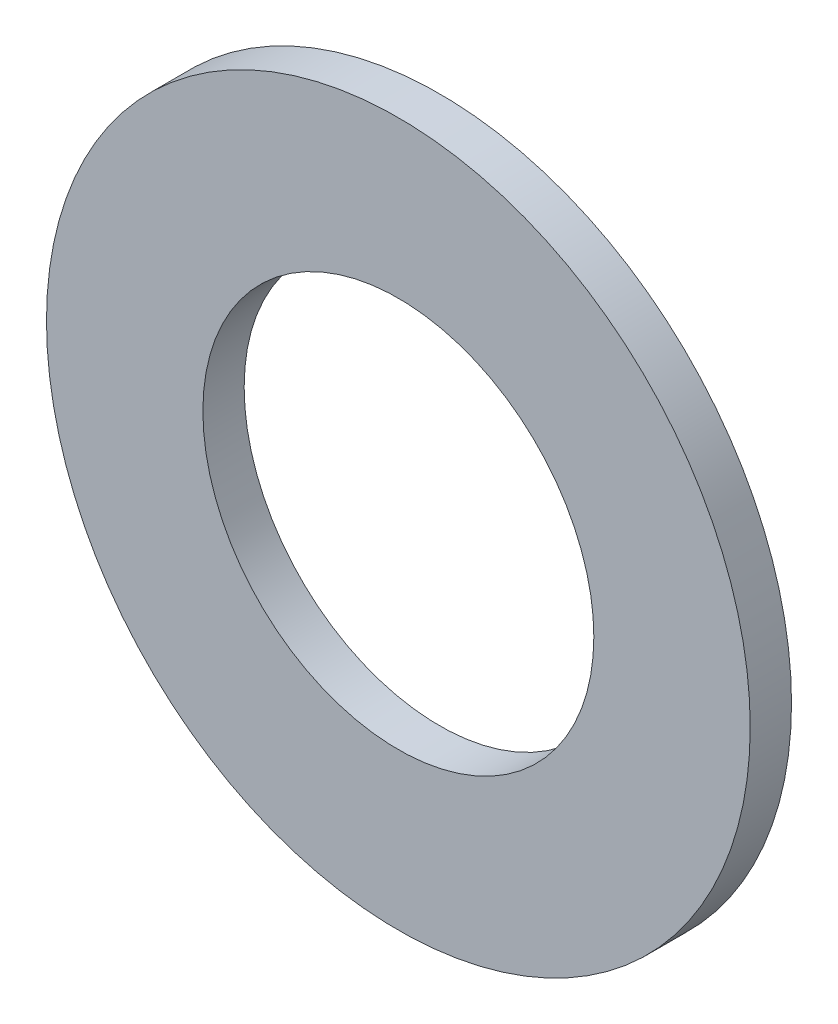
ISO-10303-21;
HEADER;
FILE_DESCRIPTION(('STEP AP214'),'2;1');
FILE_NAME('part.step','',(''),(''),'','','');
FILE_SCHEMA(('AUTOMOTIVE_DESIGN { 1 0 10303 214 1 1 1 1 }'));
ENDSEC;
DATA;
#1=APPLICATION_CONTEXT('core data for automotive mechanical design processes');
#2=APPLICATION_PROTOCOL_DEFINITION('international standard','automotive_design',2000,#1);
#3=PRODUCT_CONTEXT('',#1,'mechanical');
#4=PRODUCT('Part','Part','',(#3));
#5=PRODUCT_RELATED_PRODUCT_CATEGORY('part','',(#4));
#6=PRODUCT_DEFINITION_FORMATION('','',#4);
#7=PRODUCT_DEFINITION_CONTEXT('part definition',#1,'design');
#8=PRODUCT_DEFINITION('design','',#6,#7);
#9=PRODUCT_DEFINITION_SHAPE('','',#8);
#10=(LENGTH_UNIT() NAMED_UNIT(*) SI_UNIT(.MILLI.,.METRE.));
#11=(NAMED_UNIT(*) PLANE_ANGLE_UNIT() SI_UNIT($,.RADIAN.));
#12=(NAMED_UNIT(*) SI_UNIT($,.STERADIAN.) SOLID_ANGLE_UNIT());
#13=UNCERTAINTY_MEASURE_WITH_UNIT(LENGTH_MEASURE(1.E-05),#10,'distance_accuracy_value','');
#14=(GEOMETRIC_REPRESENTATION_CONTEXT(3) GLOBAL_UNCERTAINTY_ASSIGNED_CONTEXT((#13)) GLOBAL_UNIT_ASSIGNED_CONTEXT((#10,
#11,#12)) REPRESENTATION_CONTEXT('',''));
#15=CARTESIAN_POINT('',(0.,0.,0.));
#16=DIRECTION('',(0.,0.,1.));
#17=DIRECTION('',(1.,0.,0.));
#18=AXIS2_PLACEMENT_3D('',#15,#16,#17);
#19=CARTESIAN_POINT('',(0.,0.,1.6764));
#20=DIRECTION('',(0.,0.,1.));
#21=DIRECTION('',(1.,0.,0.));
#22=AXIS2_PLACEMENT_3D('',#19,#20,#21);
#23=PLANE('',#22);
#24=CARTESIAN_POINT('',(0.,0.,1.6764));
#25=DIRECTION('',(0.,0.,1.));
#26=DIRECTION('',(1.,0.,0.));
#27=AXIS2_PLACEMENT_3D('',#24,#25,#26);
#28=CIRCLE('',#27,14.2875);
#29=CARTESIAN_POINT('',(14.2875,0.,1.6764));
#30=VERTEX_POINT('',#29);
#31=EDGE_CURVE('E10',#30,#30,#28,.T.);
#32=ORIENTED_EDGE('',*,*,#31,.T.);
#33=EDGE_LOOP('',(#32));
#34=FACE_BOUND('',#33,.T.);
#35=CARTESIAN_POINT('',(0.,0.,1.6764));
#36=DIRECTION('',(0.,0.,1.));
#37=DIRECTION('',(1.,0.,0.));
#38=AXIS2_PLACEMENT_3D('',#35,#36,#37);
#39=CIRCLE('',#38,7.9375);
#40=CARTESIAN_POINT('',(7.9375,0.,1.6764));
#41=VERTEX_POINT('',#40);
#42=EDGE_CURVE('E42',#41,#41,#39,.T.);
#43=ORIENTED_EDGE('',*,*,#42,.F.);
#44=EDGE_LOOP('',(#43));
#45=FACE_BOUND('',#44,.T.);
#46=ADVANCED_FACE('F31',(#34,#45),#23,.T.);
#47=CARTESIAN_POINT('',(0.,0.,0.));
#48=DIRECTION('',(0.,0.,1.));
#49=DIRECTION('',(1.,0.,0.));
#50=AXIS2_PLACEMENT_3D('',#47,#48,#49);
#51=PLANE('',#50);
#52=CARTESIAN_POINT('',(0.,0.,0.));
#53=DIRECTION('',(0.,0.,1.));
#54=DIRECTION('',(1.,0.,0.));
#55=AXIS2_PLACEMENT_3D('',#52,#53,#54);
#56=CIRCLE('',#55,14.2875);
#57=CARTESIAN_POINT('',(14.2875,0.,0.));
#58=VERTEX_POINT('',#57);
#59=EDGE_CURVE('E35',#58,#58,#56,.T.);
#60=ORIENTED_EDGE('',*,*,#59,.F.);
#61=EDGE_LOOP('',(#60));
#62=FACE_BOUND('',#61,.T.);
#63=CARTESIAN_POINT('',(0.,0.,0.));
#64=DIRECTION('',(0.,0.,1.));
#65=DIRECTION('',(1.,0.,0.));
#66=AXIS2_PLACEMENT_3D('',#63,#64,#65);
#67=CIRCLE('',#66,7.9375);
#68=CARTESIAN_POINT('',(7.9375,0.,0.));
#69=VERTEX_POINT('',#68);
#70=EDGE_CURVE('E44',#69,#69,#67,.T.);
#71=ORIENTED_EDGE('',*,*,#70,.T.);
#72=EDGE_LOOP('',(#71));
#73=FACE_BOUND('',#72,.T.);
#74=ADVANCED_FACE('F54',(#62,#73),#51,.F.);
#75=CARTESIAN_POINT('',(0.,0.,1.6764));
#76=DIRECTION('',(0.,0.,-1.));
#77=DIRECTION('',(-1.,0.,0.));
#78=AXIS2_PLACEMENT_3D('',#75,#76,#77);
#79=CYLINDRICAL_SURFACE('',#78,14.2875);
#80=ORIENTED_EDGE('',*,*,#31,.F.);
#81=EDGE_LOOP('',(#80));
#82=FACE_BOUND('',#81,.T.);
#83=ORIENTED_EDGE('',*,*,#59,.T.);
#84=EDGE_LOOP('',(#83));
#85=FACE_BOUND('',#84,.T.);
#86=ADVANCED_FACE('F33',(#82,#85),#79,.T.);
#87=CARTESIAN_POINT('',(0.,0.,1.6764));
#88=DIRECTION('',(0.,0.,-1.));
#89=DIRECTION('',(-1.,0.,0.));
#90=AXIS2_PLACEMENT_3D('',#87,#88,#89);
#91=CYLINDRICAL_SURFACE('',#90,7.9375);
#92=ORIENTED_EDGE('',*,*,#42,.T.);
#93=EDGE_LOOP('',(#92));
#94=FACE_BOUND('',#93,.T.);
#95=ORIENTED_EDGE('',*,*,#70,.F.);
#96=EDGE_LOOP('',(#95));
#97=FACE_BOUND('',#96,.T.);
#98=ADVANCED_FACE('F50',(#94,#97),#91,.F.);
#99=CLOSED_SHELL('',(#46,#74,#86,#98));
#100=MANIFOLD_SOLID_BREP('B2',#99);
#101=ADVANCED_BREP_SHAPE_REPRESENTATION('',(#18,#100),#14);
#102=SHAPE_DEFINITION_REPRESENTATION(#9,#101);
ENDSEC;
END-ISO-10303-21;
